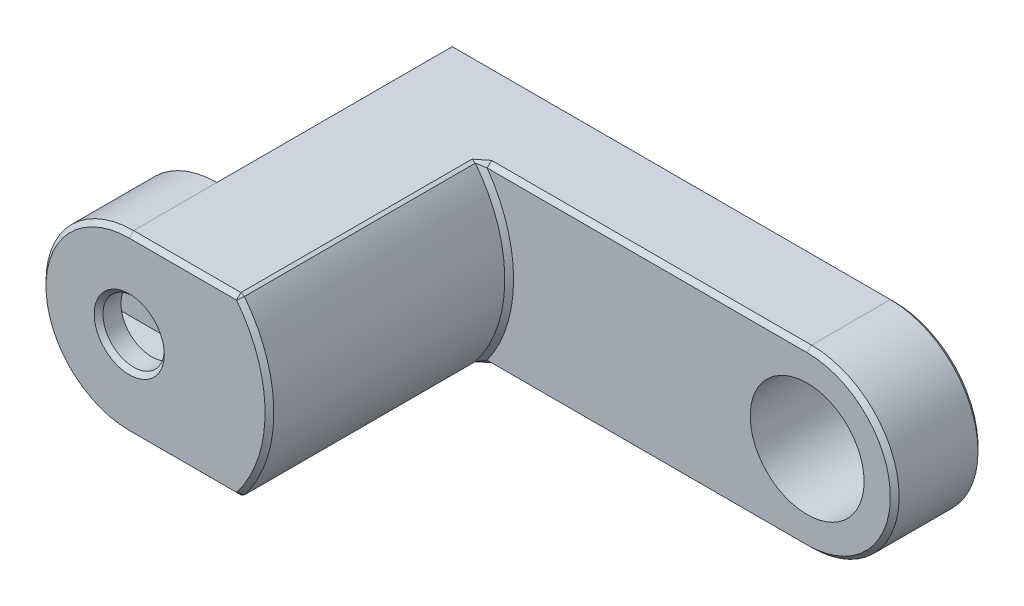
ISO-10303-21;
HEADER;
FILE_DESCRIPTION(('STEP AP214'),'2;1');
FILE_NAME('part.step','',(''),(''),'','','');
FILE_SCHEMA(('AUTOMOTIVE_DESIGN { 1 0 10303 214 1 1 1 1 }'));
ENDSEC;
DATA;
#1=APPLICATION_CONTEXT('core data for automotive mechanical design processes');
#2=APPLICATION_PROTOCOL_DEFINITION('international standard','automotive_design',2000,#1);
#3=PRODUCT_CONTEXT('',#1,'mechanical');
#4=PRODUCT('Part','Part','',(#3));
#5=PRODUCT_RELATED_PRODUCT_CATEGORY('part','',(#4));
#6=PRODUCT_DEFINITION_FORMATION('','',#4);
#7=PRODUCT_DEFINITION_CONTEXT('part definition',#1,'design');
#8=PRODUCT_DEFINITION('design','',#6,#7);
#9=PRODUCT_DEFINITION_SHAPE('','',#8);
#10=(LENGTH_UNIT() NAMED_UNIT(*) SI_UNIT(.MILLI.,.METRE.));
#11=(NAMED_UNIT(*) PLANE_ANGLE_UNIT() SI_UNIT($,.RADIAN.));
#12=(NAMED_UNIT(*) SI_UNIT($,.STERADIAN.) SOLID_ANGLE_UNIT());
#13=UNCERTAINTY_MEASURE_WITH_UNIT(LENGTH_MEASURE(1.E-05),#10,'distance_accuracy_value','');
#14=(GEOMETRIC_REPRESENTATION_CONTEXT(3) GLOBAL_UNCERTAINTY_ASSIGNED_CONTEXT((#13)) GLOBAL_UNIT_ASSIGNED_CONTEXT((#10,
#11,#12)) REPRESENTATION_CONTEXT('',''));
#15=CARTESIAN_POINT('',(0.,0.,0.));
#16=DIRECTION('',(0.,0.,1.));
#17=DIRECTION('',(1.,0.,0.));
#18=AXIS2_PLACEMENT_3D('',#15,#16,#17);
#19=CARTESIAN_POINT('',(13.,0.,18.68));
#20=DIRECTION('',(0.,0.,-1.));
#21=DIRECTION('',(-1.,0.,0.));
#22=AXIS2_PLACEMENT_3D('',#19,#20,#21);
#23=CYLINDRICAL_SURFACE('',#22,5.);
#24=DIRECTION('',(0.,0.,-1.));
#25=VECTOR('',#24,1.);
#26=CARTESIAN_POINT('',(13.,-5.,5.));
#27=LINE('',#26,#25);
#28=CARTESIAN_POINT('',(13.,-5.,18.43));
#29=VERTEX_POINT('',#28);
#30=CARTESIAN_POINT('',(13.,-5.,13.68));
#31=VERTEX_POINT('',#30);
#32=EDGE_CURVE('E252',#29,#31,#27,.T.);
#33=ORIENTED_EDGE('',*,*,#32,.F.);
#34=CARTESIAN_POINT('',(13.,0.,18.43));
#35=DIRECTION('',(0.,0.,1.));
#36=DIRECTION('',(1.,0.,0.));
#37=AXIS2_PLACEMENT_3D('',#34,#35,#36);
#38=CIRCLE('',#37,5.);
#39=CARTESIAN_POINT('',(13.,5.,18.43));
#40=VERTEX_POINT('',#39);
#41=EDGE_CURVE('E352',#29,#40,#38,.F.);
#42=ORIENTED_EDGE('',*,*,#41,.T.);
#43=DIRECTION('',(0.,0.,-1.));
#44=VECTOR('',#43,1.);
#45=CARTESIAN_POINT('',(13.,5.,5.));
#46=LINE('',#45,#44);
#47=CARTESIAN_POINT('',(13.,5.,13.68));
#48=VERTEX_POINT('',#47);
#49=EDGE_CURVE('E239',#40,#48,#46,.T.);
#50=ORIENTED_EDGE('',*,*,#49,.T.);
#51=CARTESIAN_POINT('',(13.,0.,13.68));
#52=DIRECTION('',(0.,0.,-1.));
#53=DIRECTION('',(-1.,0.,0.));
#54=AXIS2_PLACEMENT_3D('',#51,#52,#53);
#55=CIRCLE('',#54,5.);
#56=EDGE_CURVE('E233',#31,#48,#55,.T.);
#57=ORIENTED_EDGE('',*,*,#56,.F.);
#58=EDGE_LOOP('',(#33,#42,#50,#57));
#59=FACE_BOUND('',#58,.T.);
#60=CARTESIAN_POINT('',(13.,0.,14.955));
#61=DIRECTION('',(0.,0.,1.));
#62=DIRECTION('',(1.,0.,0.));
#63=AXIS2_PLACEMENT_3D('',#60,#61,#62);
#64=CIRCLE('',#63,5.);
#65=CARTESIAN_POINT('',(8.85753696455841,2.8,14.955));
#66=VERTEX_POINT('',#65);
#67=CARTESIAN_POINT('',(8.85753696455841,-2.8,14.955));
#68=VERTEX_POINT('',#67);
#69=EDGE_CURVE('E187',#66,#68,#64,.T.);
#70=ORIENTED_EDGE('',*,*,#69,.F.);
#71=DIRECTION('',(0.,0.,-1.));
#72=VECTOR('',#71,1.);
#73=CARTESIAN_POINT('',(8.85753696455841,2.8,18.68));
#74=LINE('',#73,#72);
#75=CARTESIAN_POINT('',(8.85753696455841,2.8,17.405));
#76=VERTEX_POINT('',#75);
#77=EDGE_CURVE('E11',#66,#76,#74,.F.);
#78=ORIENTED_EDGE('',*,*,#77,.T.);
#79=CARTESIAN_POINT('',(13.,0.,17.405));
#80=DIRECTION('',(0.,0.,1.));
#81=DIRECTION('',(1.,0.,0.));
#82=AXIS2_PLACEMENT_3D('',#79,#80,#81);
#83=CIRCLE('',#82,5.);
#84=CARTESIAN_POINT('',(8.85753696455841,-2.8,17.405));
#85=VERTEX_POINT('',#84);
#86=EDGE_CURVE('E222',#76,#85,#83,.T.);
#87=ORIENTED_EDGE('',*,*,#86,.T.);
#88=DIRECTION('',(0.,0.,-1.));
#89=VECTOR('',#88,1.);
#90=CARTESIAN_POINT('',(8.85753696455841,-2.8,18.68));
#91=LINE('',#90,#89);
#92=EDGE_CURVE('E50',#85,#68,#91,.T.);
#93=ORIENTED_EDGE('',*,*,#92,.T.);
#94=EDGE_LOOP('',(#70,#78,#87,#93));
#95=FACE_BOUND('',#94,.T.);
#96=ADVANCED_FACE('F40',(#59,#95),#23,.T.);
#97=CARTESIAN_POINT('',(13.,0.,18.68));
#98=DIRECTION('',(0.,0.,-1.));
#99=DIRECTION('',(-1.,0.,0.));
#100=AXIS2_PLACEMENT_3D('',#97,#98,#99);
#101=CYLINDRICAL_SURFACE('',#100,1.75);
#102=CARTESIAN_POINT('',(13.,0.,13.68));
#103=DIRECTION('',(0.,0.,-1.));
#104=DIRECTION('',(-1.,0.,0.));
#105=AXIS2_PLACEMENT_3D('',#102,#103,#104);
#106=CIRCLE('',#105,1.75);
#107=CARTESIAN_POINT('',(11.25,0.,13.68));
#108=VERTEX_POINT('',#107);
#109=EDGE_CURVE('E229',#108,#108,#106,.T.);
#110=ORIENTED_EDGE('',*,*,#109,.T.);
#111=EDGE_LOOP('',(#110));
#112=FACE_BOUND('',#111,.T.);
#113=CARTESIAN_POINT('',(13.,0.,14.955));
#114=DIRECTION('',(0.,0.,1.));
#115=DIRECTION('',(1.,0.,0.));
#116=AXIS2_PLACEMENT_3D('',#113,#114,#115);
#117=CIRCLE('',#116,1.75);
#118=CARTESIAN_POINT('',(14.75,0.,14.955));
#119=VERTEX_POINT('',#118);
#120=EDGE_CURVE('E226',#119,#119,#117,.T.);
#121=ORIENTED_EDGE('',*,*,#120,.T.);
#122=EDGE_LOOP('',(#121));
#123=FACE_BOUND('',#122,.T.);
#124=ADVANCED_FACE('F396',(#112,#123),#101,.F.);
#125=CARTESIAN_POINT('',(13.,0.,5.));
#126=DIRECTION('',(0.,0.,-1.));
#127=DIRECTION('',(-1.,0.,0.));
#128=AXIS2_PLACEMENT_3D('',#125,#126,#127);
#129=CYLINDRICAL_SURFACE('',#128,5.);
#130=CARTESIAN_POINT('',(13.,-5.,0.249999999999996));
#131=VERTEX_POINT('',#130);
#132=EDGE_CURVE('E251',#31,#131,#27,.T.);
#133=ORIENTED_EDGE('',*,*,#132,.F.);
#134=EDGE_CURVE('E234',#48,#31,#55,.T.);
#135=ORIENTED_EDGE('',*,*,#134,.F.);
#136=CARTESIAN_POINT('',(13.,5.,0.249999999999996));
#137=VERTEX_POINT('',#136);
#138=EDGE_CURVE('E243',#48,#137,#46,.T.);
#139=ORIENTED_EDGE('',*,*,#138,.T.);
#140=CARTESIAN_POINT('',(13.,0.,0.249999999999996));
#141=DIRECTION('',(0.,0.,1.));
#142=DIRECTION('',(1.,0.,0.));
#143=AXIS2_PLACEMENT_3D('',#140,#141,#142);
#144=CIRCLE('',#143,5.);
#145=EDGE_CURVE('E303',#137,#131,#144,.F.);
#146=ORIENTED_EDGE('',*,*,#145,.T.);
#147=EDGE_LOOP('',(#133,#135,#139,#146));
#148=FACE_BOUND('',#147,.T.);
#149=ADVANCED_FACE('F393',(#148),#129,.F.);
#150=CARTESIAN_POINT('',(38.,-5.,5.));
#151=DIRECTION('',(0.,1.,0.));
#152=DIRECTION('',(-1.,0.,0.));
#153=AXIS2_PLACEMENT_3D('',#150,#151,#152);
#154=PLANE('',#153);
#155=DIRECTION('',(-1.,0.,0.));
#156=VECTOR('',#155,1.);
#157=CARTESIAN_POINT('',(19.2449979983984,-5.,4.74999999999996));
#158=LINE('',#157,#156);
#159=CARTESIAN_POINT('',(38.,-5.,4.74999999999996));
#160=VERTEX_POINT('',#159);
#161=CARTESIAN_POINT('',(19.7453687816161,-5.,4.74999999999996));
#162=VERTEX_POINT('',#161);
#163=EDGE_CURVE('E263',#160,#162,#158,.T.);
#164=ORIENTED_EDGE('',*,*,#163,.T.);
#165=CARTESIAN_POINT('',(19.1237243569579,-5.,5.25000000000004));
#166=CARTESIAN_POINT('',(19.2155568659957,-5.,5.17613743050283));
#167=CARTESIAN_POINT('',(19.3073893750334,-5.,5.10227486100562));
#168=CARTESIAN_POINT('',(19.4569130336619,-5.,4.98201024292367));
#169=CARTESIAN_POINT('',(19.5146041832528,-5.,4.93560819433893));
#170=CARTESIAN_POINT('',(19.6299864824344,-5.,4.84280409716944));
#171=CARTESIAN_POINT('',(19.6876776320253,-5.,4.7964020485847));
#172=CARTESIAN_POINT('',(19.7453687816161,-5.,4.74999999999996));
#173=B_SPLINE_CURVE_WITH_KNOTS('',3,(#165,#166,#167,#168,#169,#170,#171,#172),.UNSPECIFIED.,.F.,
.F.,(4,2,2,4),(0.,0.353553390593329,0.575663205067505,0.797773019541681),.UNSPECIFIED.);
#174=CARTESIAN_POINT('',(19.1237243569579,-5.,5.25000000000004));
#175=VERTEX_POINT('',#174);
#176=EDGE_CURVE('E365',#162,#175,#173,.F.);
#177=ORIENTED_EDGE('',*,*,#176,.T.);
#178=DIRECTION('',(0.,0.,1.));
#179=VECTOR('',#178,1.);
#180=CARTESIAN_POINT('',(19.1237243569579,-5.,5.));
#181=LINE('',#180,#179);
#182=CARTESIAN_POINT('',(19.1237243569579,-5.,18.43));
#183=VERTEX_POINT('',#182);
#184=EDGE_CURVE('E260',#175,#183,#181,.T.);
#185=ORIENTED_EDGE('',*,*,#184,.T.);
#186=DIRECTION('',(-1.,0.,0.));
#187=VECTOR('',#186,1.);
#188=CARTESIAN_POINT('',(13.,-5.,18.43));
#189=LINE('',#188,#187);
#190=EDGE_CURVE('E256',#183,#29,#189,.T.);
#191=ORIENTED_EDGE('',*,*,#190,.T.);
#192=ORIENTED_EDGE('',*,*,#32,.T.);
#193=ORIENTED_EDGE('',*,*,#132,.T.);
#194=DIRECTION('',(1.,0.,0.));
#195=VECTOR('',#194,1.);
#196=CARTESIAN_POINT('',(38.,-5.,0.249999999999996));
#197=LINE('',#196,#195);
#198=CARTESIAN_POINT('',(38.,-5.,0.249999999999996));
#199=VERTEX_POINT('',#198);
#200=EDGE_CURVE('E266',#131,#199,#197,.T.);
#201=ORIENTED_EDGE('',*,*,#200,.T.);
#202=DIRECTION('',(0.,0.,-1.));
#203=VECTOR('',#202,1.);
#204=CARTESIAN_POINT('',(38.,-5.,5.));
#205=LINE('',#204,#203);
#206=EDGE_CURVE('E247',#160,#199,#205,.T.);
#207=ORIENTED_EDGE('',*,*,#206,.F.);
#208=EDGE_LOOP('',(#164,#177,#185,#191,#192,#193,#201,#207));
#209=FACE_BOUND('',#208,.T.);
#210=ADVANCED_FACE('F389',(#209),#154,.F.);
#211=CARTESIAN_POINT('',(38.,0.,5.));
#212=DIRECTION('',(0.,0.,-1.));
#213=DIRECTION('',(-1.,0.,0.));
#214=AXIS2_PLACEMENT_3D('',#211,#212,#213);
#215=CYLINDRICAL_SURFACE('',#214,5.);
#216=ORIENTED_EDGE('',*,*,#206,.T.);
#217=CARTESIAN_POINT('',(38.,0.,0.249999999999996));
#218=DIRECTION('',(0.,0.,1.));
#219=DIRECTION('',(1.,0.,0.));
#220=AXIS2_PLACEMENT_3D('',#217,#218,#219);
#221=CIRCLE('',#220,5.);
#222=CARTESIAN_POINT('',(38.,5.,0.249999999999996));
#223=VERTEX_POINT('',#222);
#224=EDGE_CURVE('E286',#199,#223,#221,.T.);
#225=ORIENTED_EDGE('',*,*,#224,.T.);
#226=DIRECTION('',(0.,0.,-1.));
#227=VECTOR('',#226,1.);
#228=CARTESIAN_POINT('',(38.,5.,5.));
#229=LINE('',#228,#227);
#230=CARTESIAN_POINT('',(38.,5.,4.74999999999996));
#231=VERTEX_POINT('',#230);
#232=EDGE_CURVE('E242',#231,#223,#229,.T.);
#233=ORIENTED_EDGE('',*,*,#232,.F.);
#234=CARTESIAN_POINT('',(38.,0.,4.74999999999996));
#235=DIRECTION('',(0.,0.,1.));
#236=DIRECTION('',(1.,0.,0.));
#237=AXIS2_PLACEMENT_3D('',#234,#235,#236);
#238=CIRCLE('',#237,5.);
#239=EDGE_CURVE('E283',#231,#160,#238,.F.);
#240=ORIENTED_EDGE('',*,*,#239,.T.);
#241=EDGE_LOOP('',(#216,#225,#233,#240));
#242=FACE_BOUND('',#241,.T.);
#243=ADVANCED_FACE('F384',(#242),#215,.T.);
#244=CARTESIAN_POINT('',(13.,5.,5.));
#245=DIRECTION('',(0.,-1.,0.));
#246=DIRECTION('',(1.,0.,0.));
#247=AXIS2_PLACEMENT_3D('',#244,#245,#246);
#248=PLANE('',#247);
#249=DIRECTION('',(0.,0.,-1.));
#250=VECTOR('',#249,1.);
#251=CARTESIAN_POINT('',(19.1237243569579,5.,5.));
#252=LINE('',#251,#250);
#253=CARTESIAN_POINT('',(19.1237243569579,5.,18.43));
#254=VERTEX_POINT('',#253);
#255=CARTESIAN_POINT('',(19.1237243569579,5.,5.25000000000004));
#256=VERTEX_POINT('',#255);
#257=EDGE_CURVE('E292',#254,#256,#252,.T.);
#258=ORIENTED_EDGE('',*,*,#257,.T.);
#259=CARTESIAN_POINT('',(19.7453687816161,5.,4.74999999999996));
#260=CARTESIAN_POINT('',(19.6535362725784,5.,4.82386256949717));
#261=CARTESIAN_POINT('',(19.5617037635407,5.,4.89772513899438));
#262=CARTESIAN_POINT('',(19.4121801049121,5.,5.01798975707633));
#263=CARTESIAN_POINT('',(19.3544889553213,5.,5.06439180566108));
#264=CARTESIAN_POINT('',(19.2391066561396,5.,5.15719590283056));
#265=CARTESIAN_POINT('',(19.1814155065488,5.,5.2035979514153));
#266=CARTESIAN_POINT('',(19.1237243569579,5.,5.25000000000004));
#267=B_SPLINE_CURVE_WITH_KNOTS('',3,(#259,#260,#261,#262,#263,#264,#265,#266),.UNSPECIFIED.,.F.,
.F.,(4,2,2,4),(0.,0.353553390593328,0.575663205067509,0.797773019541684),.UNSPECIFIED.);
#268=CARTESIAN_POINT('',(19.7453687816161,5.,4.74999999999996));
#269=VERTEX_POINT('',#268);
#270=EDGE_CURVE('E356',#256,#269,#267,.F.);
#271=ORIENTED_EDGE('',*,*,#270,.T.);
#272=DIRECTION('',(1.,0.,0.));
#273=VECTOR('',#272,1.);
#274=CARTESIAN_POINT('',(38.,5.,4.74999999999996));
#275=LINE('',#274,#273);
#276=EDGE_CURVE('E296',#269,#231,#275,.T.);
#277=ORIENTED_EDGE('',*,*,#276,.T.);
#278=ORIENTED_EDGE('',*,*,#232,.T.);
#279=DIRECTION('',(-1.,0.,0.));
#280=VECTOR('',#279,1.);
#281=CARTESIAN_POINT('',(13.,5.,0.249999999999996));
#282=LINE('',#281,#280);
#283=EDGE_CURVE('E299',#223,#137,#282,.T.);
#284=ORIENTED_EDGE('',*,*,#283,.T.);
#285=ORIENTED_EDGE('',*,*,#138,.F.);
#286=ORIENTED_EDGE('',*,*,#49,.F.);
#287=DIRECTION('',(1.,0.,0.));
#288=VECTOR('',#287,1.);
#289=CARTESIAN_POINT('',(19.2449979983984,5.,18.43));
#290=LINE('',#289,#288);
#291=EDGE_CURVE('E289',#40,#254,#290,.T.);
#292=ORIENTED_EDGE('',*,*,#291,.T.);
#293=EDGE_LOOP('',(#258,#271,#277,#278,#284,#285,#286,#292));
#294=FACE_BOUND('',#293,.T.);
#295=ADVANCED_FACE('F378',(#294),#248,.F.);
#296=CARTESIAN_POINT('',(13.,0.,5.));
#297=DIRECTION('',(0.,0.,1.));
#298=DIRECTION('',(1.,0.,0.));
#299=AXIS2_PLACEMENT_3D('',#296,#297,#298);
#300=PLANE('',#299);
#301=CARTESIAN_POINT('',(38.,0.,5.));
#302=DIRECTION('',(0.,0.,1.));
#303=DIRECTION('',(1.,0.,0.));
#304=AXIS2_PLACEMENT_3D('',#301,#302,#303);
#305=CIRCLE('',#304,3.25);
#306=CARTESIAN_POINT('',(41.25,0.,5.));
#307=VERTEX_POINT('',#306);
#308=EDGE_CURVE('E213',#307,#307,#305,.F.);
#309=ORIENTED_EDGE('',*,*,#308,.T.);
#310=EDGE_LOOP('',(#309));
#311=FACE_BOUND('',#310,.T.);
#312=CARTESIAN_POINT('',(38.,0.,5.));
#313=DIRECTION('',(0.,0.,1.));
#314=DIRECTION('',(1.,0.,0.));
#315=AXIS2_PLACEMENT_3D('',#312,#313,#314);
#316=CIRCLE('',#315,4.74999999999996);
#317=CARTESIAN_POINT('',(38.,-4.74999999999996,5.));
#318=VERTEX_POINT('',#317);
#319=CARTESIAN_POINT('',(38.,4.74999999999996,5.));
#320=VERTEX_POINT('',#319);
#321=EDGE_CURVE('E326',#318,#320,#316,.T.);
#322=ORIENTED_EDGE('',*,*,#321,.T.);
#323=DIRECTION('',(-1.,0.,0.));
#324=VECTOR('',#323,1.);
#325=CARTESIAN_POINT('',(19.2449979983984,4.74999999999996,5.));
#326=LINE('',#325,#324);
#327=CARTESIAN_POINT('',(19.7453687816161,4.74999999999996,5.));
#328=VERTEX_POINT('',#327);
#329=EDGE_CURVE('E329',#320,#328,#326,.T.);
#330=ORIENTED_EDGE('',*,*,#329,.T.);
#331=CARTESIAN_POINT('',(13.,0.,5.));
#332=DIRECTION('',(0.,0.,1.));
#333=DIRECTION('',(1.,0.,0.));
#334=AXIS2_PLACEMENT_3D('',#331,#332,#333);
#335=CIRCLE('',#334,8.25000000000004);
#336=CARTESIAN_POINT('',(19.7453687816161,-4.74999999999996,5.));
#337=VERTEX_POINT('',#336);
#338=EDGE_CURVE('E320',#328,#337,#335,.F.);
#339=ORIENTED_EDGE('',*,*,#338,.T.);
#340=DIRECTION('',(1.,0.,0.));
#341=VECTOR('',#340,1.);
#342=CARTESIAN_POINT('',(38.,-4.74999999999996,5.));
#343=LINE('',#342,#341);
#344=EDGE_CURVE('E323',#337,#318,#343,.T.);
#345=ORIENTED_EDGE('',*,*,#344,.T.);
#346=EDGE_LOOP('',(#322,#330,#339,#345));
#347=FACE_BOUND('',#346,.T.);
#348=ADVANCED_FACE('F383',(#311,#347),#300,.T.);
#349=CARTESIAN_POINT('',(13.,0.,0.));
#350=DIRECTION('',(0.,0.,1.));
#351=DIRECTION('',(1.,0.,0.));
#352=AXIS2_PLACEMENT_3D('',#349,#350,#351);
#353=PLANE('',#352);
#354=CARTESIAN_POINT('',(38.,0.,0.));
#355=DIRECTION('',(0.,0.,1.));
#356=DIRECTION('',(1.,0.,0.));
#357=AXIS2_PLACEMENT_3D('',#354,#355,#356);
#358=CIRCLE('',#357,3.25);
#359=CARTESIAN_POINT('',(41.25,0.,0.));
#360=VERTEX_POINT('',#359);
#361=EDGE_CURVE('E982',#360,#360,#358,.T.);
#362=ORIENTED_EDGE('',*,*,#361,.T.);
#363=EDGE_LOOP('',(#362));
#364=FACE_BOUND('',#363,.T.);
#365=CARTESIAN_POINT('',(38.,0.,0.));
#366=DIRECTION('',(0.,0.,1.));
#367=DIRECTION('',(1.,0.,0.));
#368=AXIS2_PLACEMENT_3D('',#365,#366,#367);
#369=CIRCLE('',#368,4.75);
#370=CARTESIAN_POINT('',(38.,4.75,0.));
#371=VERTEX_POINT('',#370);
#372=CARTESIAN_POINT('',(38.,-4.75,0.));
#373=VERTEX_POINT('',#372);
#374=EDGE_CURVE('E276',#371,#373,#369,.F.);
#375=ORIENTED_EDGE('',*,*,#374,.T.);
#376=DIRECTION('',(-1.,0.,0.));
#377=VECTOR('',#376,1.);
#378=CARTESIAN_POINT('',(13.,-4.75,0.));
#379=LINE('',#378,#377);
#380=CARTESIAN_POINT('',(15.2360679774998,-4.75,0.));
#381=VERTEX_POINT('',#380);
#382=EDGE_CURVE('E279',#373,#381,#379,.T.);
#383=ORIENTED_EDGE('',*,*,#382,.T.);
#384=CARTESIAN_POINT('',(13.,0.,0.));
#385=DIRECTION('',(0.,0.,1.));
#386=DIRECTION('',(1.,0.,0.));
#387=AXIS2_PLACEMENT_3D('',#384,#385,#386);
#388=CIRCLE('',#387,5.25);
#389=CARTESIAN_POINT('',(15.2360679774998,4.75,0.));
#390=VERTEX_POINT('',#389);
#391=EDGE_CURVE('E270',#381,#390,#388,.T.);
#392=ORIENTED_EDGE('',*,*,#391,.T.);
#393=DIRECTION('',(1.,0.,0.));
#394=VECTOR('',#393,1.);
#395=CARTESIAN_POINT('',(13.,4.75,0.));
#396=LINE('',#395,#394);
#397=EDGE_CURVE('E273',#390,#371,#396,.T.);
#398=ORIENTED_EDGE('',*,*,#397,.T.);
#399=EDGE_LOOP('',(#375,#383,#392,#398));
#400=FACE_BOUND('',#399,.T.);
#401=ADVANCED_FACE('F386',(#364,#400),#353,.F.);
#402=CARTESIAN_POINT('',(13.,0.,15.68));
#403=DIRECTION('',(0.,0.,-1.));
#404=DIRECTION('',(-1.,0.,0.));
#405=AXIS2_PLACEMENT_3D('',#402,#403,#404);
#406=CYLINDRICAL_SURFACE('',#405,8.);
#407=DIRECTION('',(0.,0.,-1.));
#408=VECTOR('',#407,1.);
#409=CARTESIAN_POINT('',(19.3212638523437,-4.90322580645159,15.68));
#410=LINE('',#409,#408);
#411=CARTESIAN_POINT('',(19.3212638523437,-4.90322580645159,18.43));
#412=VERTEX_POINT('',#411);
#413=CARTESIAN_POINT('',(19.3212638523437,-4.9032258064516,5.25000000000004));
#414=VERTEX_POINT('',#413);
#415=EDGE_CURVE('E310',#412,#414,#410,.T.);
#416=ORIENTED_EDGE('',*,*,#415,.T.);
#417=CARTESIAN_POINT('',(13.,0.,5.25000000000004));
#418=DIRECTION('',(0.,0.,1.));
#419=DIRECTION('',(1.,0.,0.));
#420=AXIS2_PLACEMENT_3D('',#417,#418,#419);
#421=CIRCLE('',#420,8.);
#422=CARTESIAN_POINT('',(19.3212638523437,4.9032258064516,5.25000000000004));
#423=VERTEX_POINT('',#422);
#424=EDGE_CURVE('E317',#414,#423,#421,.T.);
#425=ORIENTED_EDGE('',*,*,#424,.T.);
#426=DIRECTION('',(0.,0.,-1.));
#427=VECTOR('',#426,1.);
#428=CARTESIAN_POINT('',(19.3212638523437,4.9032258064516,15.68));
#429=LINE('',#428,#427);
#430=CARTESIAN_POINT('',(19.3212638523437,4.9032258064516,18.43));
#431=VERTEX_POINT('',#430);
#432=EDGE_CURVE('E313',#423,#431,#429,.F.);
#433=ORIENTED_EDGE('',*,*,#432,.T.);
#434=CARTESIAN_POINT('',(13.,0.,18.43));
#435=DIRECTION('',(0.,0.,1.));
#436=DIRECTION('',(1.,0.,0.));
#437=AXIS2_PLACEMENT_3D('',#434,#435,#436);
#438=CIRCLE('',#437,8.);
#439=EDGE_CURVE('E307',#431,#412,#438,.F.);
#440=ORIENTED_EDGE('',*,*,#439,.T.);
#441=EDGE_LOOP('',(#416,#425,#433,#440));
#442=FACE_BOUND('',#441,.T.);
#443=ADVANCED_FACE('F414',(#442),#406,.T.);
#444=CARTESIAN_POINT('',(13.,0.,18.68));
#445=DIRECTION('',(0.,0.,1.));
#446=DIRECTION('',(1.,0.,0.));
#447=AXIS2_PLACEMENT_3D('',#444,#445,#446);
#448=PLANE('',#447);
#449=CARTESIAN_POINT('',(13.,0.,18.68));
#450=DIRECTION('',(0.,0.,1.));
#451=DIRECTION('',(1.,0.,0.));
#452=AXIS2_PLACEMENT_3D('',#449,#450,#451);
#453=CIRCLE('',#452,2.00000000000001);
#454=CARTESIAN_POINT('',(15.,0.,18.68));
#455=VERTEX_POINT('',#454);
#456=EDGE_CURVE('E348',#455,#455,#453,.F.);
#457=ORIENTED_EDGE('',*,*,#456,.T.);
#458=EDGE_LOOP('',(#457));
#459=FACE_BOUND('',#458,.T.);
#460=CARTESIAN_POINT('',(13.,0.,18.68));
#461=DIRECTION('',(0.,0.,1.));
#462=DIRECTION('',(1.,0.,0.));
#463=AXIS2_PLACEMENT_3D('',#460,#461,#462);
#464=CIRCLE('',#463,4.75000000000001);
#465=CARTESIAN_POINT('',(13.,4.75000000000001,18.68));
#466=VERTEX_POINT('',#465);
#467=CARTESIAN_POINT('',(13.,-4.75000000000001,18.68));
#468=VERTEX_POINT('',#467);
#469=EDGE_CURVE('E65',#466,#468,#464,.T.);
#470=ORIENTED_EDGE('',*,*,#469,.T.);
#471=DIRECTION('',(1.,0.,0.));
#472=VECTOR('',#471,1.);
#473=CARTESIAN_POINT('',(19.2449979983984,-4.75000000000001,18.68));
#474=LINE('',#473,#472);
#475=CARTESIAN_POINT('',(19.123724356958,-4.75000000000001,18.68));
#476=VERTEX_POINT('',#475);
#477=EDGE_CURVE('E345',#468,#476,#474,.T.);
#478=ORIENTED_EDGE('',*,*,#477,.T.);
#479=CARTESIAN_POINT('',(13.,0.,18.68));
#480=DIRECTION('',(0.,0.,1.));
#481=DIRECTION('',(1.,0.,0.));
#482=AXIS2_PLACEMENT_3D('',#479,#480,#481);
#483=CIRCLE('',#482,7.75000000000001);
#484=CARTESIAN_POINT('',(19.123724356958,4.75000000000001,18.68));
#485=VERTEX_POINT('',#484);
#486=EDGE_CURVE('E337',#476,#485,#483,.T.);
#487=ORIENTED_EDGE('',*,*,#486,.T.);
#488=DIRECTION('',(-1.,0.,0.));
#489=VECTOR('',#488,1.);
#490=CARTESIAN_POINT('',(13.,4.75000000000001,18.68));
#491=LINE('',#490,#489);
#492=EDGE_CURVE('E340',#485,#466,#491,.T.);
#493=ORIENTED_EDGE('',*,*,#492,.T.);
#494=EDGE_LOOP('',(#470,#478,#487,#493));
#495=FACE_BOUND('',#494,.T.);
#496=ADVANCED_FACE('F413',(#459,#495),#448,.T.);
#497=CARTESIAN_POINT('',(13.,0.,17.405));
#498=DIRECTION('',(0.,0.,1.));
#499=DIRECTION('',(1.,0.,0.));
#500=AXIS2_PLACEMENT_3D('',#497,#498,#499);
#501=CIRCLE('',#500,1.75);
#502=CARTESIAN_POINT('',(14.75,0.,17.405));
#503=VERTEX_POINT('',#502);
#504=EDGE_CURVE('E220',#503,#503,#501,.T.);
#505=ORIENTED_EDGE('',*,*,#504,.F.);
#506=EDGE_LOOP('',(#505));
#507=FACE_BOUND('',#506,.T.);
#508=CARTESIAN_POINT('',(13.,0.,18.43));
#509=DIRECTION('',(0.,0.,1.));
#510=DIRECTION('',(1.,0.,0.));
#511=AXIS2_PLACEMENT_3D('',#508,#509,#510);
#512=CIRCLE('',#511,1.75);
#513=CARTESIAN_POINT('',(14.75,0.,18.43));
#514=VERTEX_POINT('',#513);
#515=EDGE_CURVE('E333',#514,#514,#512,.T.);
#516=ORIENTED_EDGE('',*,*,#515,.T.);
#517=EDGE_LOOP('',(#516));
#518=FACE_BOUND('',#517,.T.);
#519=ADVANCED_FACE('F403',(#507,#518),#101,.F.);
#520=CARTESIAN_POINT('',(13.,5.,0.249999999999996));
#521=DIRECTION('',(0.,-0.707106781186541,0.707106781186554));
#522=DIRECTION('',(-1.,0.,0.));
#523=AXIS2_PLACEMENT_3D('',#520,#521,#522);
#524=PLANE('',#523);
#525=DIRECTION('',(0.,0.707106781186554,0.707106781186541));
#526=VECTOR('',#525,1.);
#527=CARTESIAN_POINT('',(38.,4.75,0.));
#528=LINE('',#527,#526);
#529=EDGE_CURVE('E595',#371,#223,#528,.T.);
#530=ORIENTED_EDGE('',*,*,#529,.F.);
#531=ORIENTED_EDGE('',*,*,#397,.F.);
#532=CARTESIAN_POINT('',(13.,5.,0.249999999999996));
#533=CARTESIAN_POINT('',(13.0950100328751,5.00000193498748,0.250001934987482));
#534=CARTESIAN_POINT('',(13.1900092237627,4.99864567975109,0.248645679751087));
#535=CARTESIAN_POINT('',(13.3798500456755,4.99323583058947,0.243235830589469));
#536=CARTESIAN_POINT('',(13.4746916831179,4.98918234936678,0.239182349366773));
#537=CARTESIAN_POINT('',(13.7576392364466,4.97306989403023,0.223069894030223));
#538=CARTESIAN_POINT('',(13.9453238481979,4.95705827382409,0.207058273824087));
#539=CARTESIAN_POINT('',(14.3182662936352,4.91484571840696,0.164845718406955));
#540=CARTESIAN_POINT('',(14.5035250746721,4.8886488913773,0.138648891377295));
#541=CARTESIAN_POINT('',(14.8719140028892,4.8265114620302,0.0765114620301979));
#542=CARTESIAN_POINT('',(15.0550250489479,4.79051407948644,0.0405140794864393));
#543=CARTESIAN_POINT('',(15.2360679774998,4.75,0.));
#544=B_SPLINE_CURVE_WITH_KNOTS('',3,(#532,#533,#534,#535,#536,#537,#538,#539,#540,#541,#542,
#543),.UNSPECIFIED.,.F.,.F.,(4,2,2,2,2,4),(0.,0.284989443039261,0.569966978654364,
1.13646391848597,1.70273259964377,2.27235450267005),.UNSPECIFIED.);
#545=EDGE_CURVE('E585',#137,#390,#544,.T.);
#546=ORIENTED_EDGE('',*,*,#545,.F.);
#547=ORIENTED_EDGE('',*,*,#283,.F.);
#548=EDGE_LOOP('',(#530,#531,#546,#547));
#549=FACE_BOUND('',#548,.T.);
#550=ADVANCED_FACE('F602',(#549),#524,.F.);
#551=CARTESIAN_POINT('',(13.,0.,0.249999999999996));
#552=DIRECTION('',(0.,0.,-1.));
#553=DIRECTION('',(-1.,0.,0.));
#554=AXIS2_PLACEMENT_3D('',#551,#552,#553);
#555=CONICAL_SURFACE('',#554,5.,0.785398163397459);
#556=ORIENTED_EDGE('',*,*,#545,.T.);
#557=ORIENTED_EDGE('',*,*,#391,.F.);
#558=CARTESIAN_POINT('',(15.2360679774998,-4.75,0.));
#559=CARTESIAN_POINT('',(15.0550250489479,-4.79051407948644,0.0405140794864394));
#560=CARTESIAN_POINT('',(14.8719140028892,-4.8265114620302,0.0765114620301979));
#561=CARTESIAN_POINT('',(14.5035250746721,-4.8886488913773,0.138648891377295));
#562=CARTESIAN_POINT('',(14.3182662936352,-4.91484571840696,0.164845718406955));
#563=CARTESIAN_POINT('',(13.9453238481979,-4.95705827382409,0.207058273824087));
#564=CARTESIAN_POINT('',(13.7576392364466,-4.97306989403022,0.223069894030223));
#565=CARTESIAN_POINT('',(13.4746916831179,-4.98918234936678,0.239182349366773));
#566=CARTESIAN_POINT('',(13.3798500456755,-4.99323583058947,0.243235830589469));
#567=CARTESIAN_POINT('',(13.1900092237627,-4.99864567975109,0.248645679751088));
#568=CARTESIAN_POINT('',(13.0950100328751,-5.00000193498748,0.250001934987482));
#569=CARTESIAN_POINT('',(13.,-5.,0.249999999999996));
#570=B_SPLINE_CURVE_WITH_KNOTS('',3,(#558,#559,#560,#561,#562,#563,#564,#565,#566,#567,#568,
#569),.UNSPECIFIED.,.F.,.F.,(4,2,2,2,2,4),(0.,0.569621903026277,1.13589058418408,
1.70238752401568,1.98736505963079,2.27235450267005),.UNSPECIFIED.);
#571=EDGE_CURVE('E675',#131,#381,#570,.F.);
#572=ORIENTED_EDGE('',*,*,#571,.F.);
#573=ORIENTED_EDGE('',*,*,#145,.F.);
#574=EDGE_LOOP('',(#556,#557,#572,#573));
#575=FACE_BOUND('',#574,.T.);
#576=ADVANCED_FACE('F598',(#575),#555,.F.);
#577=CARTESIAN_POINT('',(38.,0.,0.249999999999996));
#578=DIRECTION('',(0.,0.,1.));
#579=DIRECTION('',(1.,0.,0.));
#580=AXIS2_PLACEMENT_3D('',#577,#578,#579);
#581=CONICAL_SURFACE('',#580,5.,0.785398163397457);
#582=ORIENTED_EDGE('',*,*,#529,.T.);
#583=ORIENTED_EDGE('',*,*,#224,.F.);
#584=DIRECTION('',(0.,-0.707106781186554,0.707106781186541));
#585=VECTOR('',#584,1.);
#586=CARTESIAN_POINT('',(38.,-4.75,0.));
#587=LINE('',#586,#585);
#588=EDGE_CURVE('E495',#373,#199,#587,.T.);
#589=ORIENTED_EDGE('',*,*,#588,.F.);
#590=ORIENTED_EDGE('',*,*,#374,.F.);
#591=EDGE_LOOP('',(#582,#583,#589,#590));
#592=FACE_BOUND('',#591,.T.);
#593=ADVANCED_FACE('F611',(#592),#581,.T.);
#594=CARTESIAN_POINT('',(38.,-5.,0.249999999999996));
#595=DIRECTION('',(0.,0.707106781186541,0.707106781186554));
#596=DIRECTION('',(1.,0.,0.));
#597=AXIS2_PLACEMENT_3D('',#594,#595,#596);
#598=PLANE('',#597);
#599=ORIENTED_EDGE('',*,*,#571,.T.);
#600=ORIENTED_EDGE('',*,*,#382,.F.);
#601=ORIENTED_EDGE('',*,*,#588,.T.);
#602=ORIENTED_EDGE('',*,*,#200,.F.);
#603=EDGE_LOOP('',(#599,#600,#601,#602));
#604=FACE_BOUND('',#603,.T.);
#605=ADVANCED_FACE('F662',(#604),#598,.F.);
#606=CARTESIAN_POINT('',(13.,-4.75000000000001,18.68));
#607=DIRECTION('',(0.,-0.707106781186547,0.707106781186547));
#608=DIRECTION('',(-1.,0.,0.));
#609=AXIS2_PLACEMENT_3D('',#606,#607,#608);
#610=PLANE('',#609);
#611=DIRECTION('',(0.,0.707106781186547,0.707106781186547));
#612=VECTOR('',#611,1.);
#613=CARTESIAN_POINT('',(13.,-5.,18.43));
#614=LINE('',#613,#612);
#615=EDGE_CURVE('E478',#29,#468,#614,.T.);
#616=ORIENTED_EDGE('',*,*,#615,.F.);
#617=ORIENTED_EDGE('',*,*,#190,.F.);
#618=DIRECTION('',(0.,-0.707106781186548,-0.707106781186548));
#619=VECTOR('',#618,1.);
#620=CARTESIAN_POINT('',(19.1237243569579,-5.,18.43));
#621=LINE('',#620,#619);
#622=EDGE_CURVE('E487',#476,#183,#621,.T.);
#623=ORIENTED_EDGE('',*,*,#622,.F.);
#624=ORIENTED_EDGE('',*,*,#477,.F.);
#625=EDGE_LOOP('',(#616,#617,#623,#624));
#626=FACE_BOUND('',#625,.T.);
#627=ADVANCED_FACE('F518',(#626),#610,.T.);
#628=CARTESIAN_POINT('',(13.,-4.74999999999996,5.));
#629=DIRECTION('',(0.,-0.707106781186545,0.70710678118655));
#630=DIRECTION('',(-1.,0.,0.));
#631=AXIS2_PLACEMENT_3D('',#628,#629,#630);
#632=PLANE('',#631);
#633=DIRECTION('',(0.,0.70710678118655,0.707106781186545));
#634=VECTOR('',#633,1.);
#635=CARTESIAN_POINT('',(19.7453687816161,-5.,4.74999999999996));
#636=LINE('',#635,#634);
#637=EDGE_CURVE('E467',#162,#337,#636,.T.);
#638=ORIENTED_EDGE('',*,*,#637,.F.);
#639=ORIENTED_EDGE('',*,*,#163,.F.);
#640=DIRECTION('',(0.,-0.70710678118655,-0.707106781186545));
#641=VECTOR('',#640,1.);
#642=CARTESIAN_POINT('',(38.,-4.74999999999996,5.));
#643=LINE('',#642,#641);
#644=EDGE_CURVE('E469',#318,#160,#643,.T.);
#645=ORIENTED_EDGE('',*,*,#644,.F.);
#646=ORIENTED_EDGE('',*,*,#344,.F.);
#647=EDGE_LOOP('',(#638,#639,#645,#646));
#648=FACE_BOUND('',#647,.T.);
#649=ADVANCED_FACE('F465',(#648),#632,.T.);
#650=CARTESIAN_POINT('',(19.3212638523437,-4.90322580645159,15.68));
#651=DIRECTION('',(-0.439941345064067,0.898026510133871,0.));
#652=DIRECTION('',(0.,0.,-1.));
#653=AXIS2_PLACEMENT_3D('',#650,#651,#652);
#654=PLANE('',#653);
#655=DIRECTION('',(-0.898026510133871,-0.439941345064067,0.));
#656=VECTOR('',#655,1.);
#657=CARTESIAN_POINT('',(19.1237243569579,-5.,18.43));
#658=LINE('',#657,#656);
#659=EDGE_CURVE('E491',#183,#412,#658,.F.);
#660=ORIENTED_EDGE('',*,*,#659,.F.);
#661=ORIENTED_EDGE('',*,*,#184,.F.);
#662=DIRECTION('',(-0.898026510133868,-0.439941345064073,0.));
#663=VECTOR('',#662,1.);
#664=CARTESIAN_POINT('',(19.3212638523437,-4.9032258064516,5.25000000000004));
#665=LINE('',#664,#663);
#666=EDGE_CURVE('E474',#414,#175,#665,.T.);
#667=ORIENTED_EDGE('',*,*,#666,.F.);
#668=ORIENTED_EDGE('',*,*,#415,.F.);
#669=EDGE_LOOP('',(#660,#661,#667,#668));
#670=FACE_BOUND('',#669,.T.);
#671=ADVANCED_FACE('F509',(#670),#654,.F.);
#672=CARTESIAN_POINT('',(19.1237243569579,-5.,18.43));
#673=DIRECTION('',(0.327326835354009,-0.668153104781072,0.66815310478104));
#674=DIRECTION('',(0.,-0.707106781186531,-0.707106781186564));
#675=AXIS2_PLACEMENT_3D('',#672,#673,#674);
#676=PLANE('',#675);
#677=ORIENTED_EDGE('',*,*,#622,.T.);
#678=ORIENTED_EDGE('',*,*,#659,.T.);
#679=DIRECTION('',(-0.558726066957752,0.433388027178784,0.70710678118655));
#680=VECTOR('',#679,1.);
#681=CARTESIAN_POINT('',(13.0000000000001,-2.02256122933635E-13,26.4300000000003));
#682=LINE('',#681,#680);
#683=EDGE_CURVE('E480',#476,#412,#682,.F.);
#684=ORIENTED_EDGE('',*,*,#683,.F.);
#685=EDGE_LOOP('',(#677,#678,#684));
#686=FACE_BOUND('',#685,.T.);
#687=ADVANCED_FACE('F515',(#686),#676,.T.);
#688=CARTESIAN_POINT('',(13.,0.,18.68));
#689=DIRECTION('',(0.,0.,-1.));
#690=DIRECTION('',(-1.,0.,0.));
#691=AXIS2_PLACEMENT_3D('',#688,#689,#690);
#692=CONICAL_SURFACE('',#691,4.75000000000001,0.785398163397448);
#693=ORIENTED_EDGE('',*,*,#615,.T.);
#694=ORIENTED_EDGE('',*,*,#469,.F.);
#695=DIRECTION('',(0.,-0.707106781186547,0.707106781186547));
#696=VECTOR('',#695,1.);
#697=CARTESIAN_POINT('',(13.,5.,18.43));
#698=LINE('',#697,#696);
#699=EDGE_CURVE('E441',#40,#466,#698,.T.);
#700=ORIENTED_EDGE('',*,*,#699,.F.);
#701=ORIENTED_EDGE('',*,*,#41,.F.);
#702=EDGE_LOOP('',(#693,#694,#700,#701));
#703=FACE_BOUND('',#702,.T.);
#704=ADVANCED_FACE('F629',(#703),#692,.T.);
#705=CARTESIAN_POINT('',(38.,0.,5.));
#706=DIRECTION('',(0.,0.,-1.));
#707=DIRECTION('',(-1.,0.,0.));
#708=AXIS2_PLACEMENT_3D('',#705,#706,#707);
#709=CONICAL_SURFACE('',#708,4.74999999999996,0.785398163397452);
#710=ORIENTED_EDGE('',*,*,#644,.T.);
#711=ORIENTED_EDGE('',*,*,#239,.F.);
#712=DIRECTION('',(0.,0.70710678118655,-0.707106781186545));
#713=VECTOR('',#712,1.);
#714=CARTESIAN_POINT('',(38.,4.74999999999996,5.));
#715=LINE('',#714,#713);
#716=EDGE_CURVE('E436',#320,#231,#715,.T.);
#717=ORIENTED_EDGE('',*,*,#716,.F.);
#718=ORIENTED_EDGE('',*,*,#321,.F.);
#719=EDGE_LOOP('',(#710,#711,#717,#718));
#720=FACE_BOUND('',#719,.T.);
#721=ADVANCED_FACE('F437',(#720),#709,.T.);
#722=CARTESIAN_POINT('',(19.3268680702067,-4.90048031161723,5.25000000000004));
#723=CARTESIAN_POINT('',(19.7453687816161,-4.74290747167784,5.00709252832212));
#724=CARTESIAN_POINT('',(19.3212638523437,-4.9032258064516,5.25000000000004));
#725=CARTESIAN_POINT('',(19.7453687816161,-4.74999999999996,5.));
#726=CARTESIAN_POINT('',(19.1237243569579,-5.,5.25000000000004));
#727=CARTESIAN_POINT('',(19.7453687816161,-5.,4.74999999999996));
#728=B_SPLINE_SURFACE_WITH_KNOTS('',1,1,((#722,#723),(#724,#725),(#726,#727)),.UNSPECIFIED.,.F.,
.F.,.F.,(2,1,2),(2,2),(-0.0283701132884727,0.,1.),(0.,1.),.UNSPECIFIED.);
#729=CARTESIAN_POINT('',(19.7453687816161,-4.74999999999996,5.));
#730=CARTESIAN_POINT('',(19.7213287450384,-4.7575383510541,5.01531594359393));
#731=CARTESIAN_POINT('',(19.6972485246344,-4.76544046581109,5.0303814057953));
#732=CARTESIAN_POINT('',(19.6490261287991,-4.78182169271637,5.0600707074903));
#733=CARTESIAN_POINT('',(19.6248839827001,-4.79030056780569,5.07469472489994));
#734=CARTESIAN_POINT('',(19.5775491324241,-4.80732693783046,5.10296802985786));
#735=CARTESIAN_POINT('',(19.5543590202602,-4.81585667966328,5.11663248698247));
#736=CARTESIAN_POINT('',(19.507916823095,-4.83315438052677,5.14371035384233));
#737=CARTESIAN_POINT('',(19.4846647293993,-4.84192237475701,5.15712372598228));
#738=CARTESIAN_POINT('',(19.4380917919602,-4.85952550187101,5.18380058839569));
#739=CARTESIAN_POINT('',(19.4147709323841,-4.86836065109961,5.19706404009031));
#740=CARTESIAN_POINT('',(19.3680666399583,-4.8859197219633,5.22354163056561));
#741=CARTESIAN_POINT('',(19.3446832211162,-4.89464366632688,5.23675577901953));
#742=CARTESIAN_POINT('',(19.3212638523437,-4.9032258064516,5.25000000000004));
#743=B_SPLINE_CURVE_WITH_KNOTS('',3,(#729,#730,#731,#732,#733,#734,#735,#736,#737,#738,#739,
#740,#741,#742),.UNSPECIFIED.,.F.,.F.,(4,2,2,2,2,2,4),(0.,0.0884436111849329,0.176851087562919,
0.261555160701997,0.346271816853864,0.431009798239878,0.515730173507393),.UNSPECIFIED.);
#744=EDGE_CURVE('E442',#414,#337,#743,.F.);
#745=ORIENTED_EDGE('',*,*,#176,.F.);
#746=ORIENTED_EDGE('',*,*,#637,.T.);
#747=ORIENTED_EDGE('',*,*,#744,.F.);
#748=ORIENTED_EDGE('',*,*,#666,.T.);
#749=EDGE_LOOP('',(#745,#746,#747,#748));
#750=FACE_BOUND('',#749,.T.);
#751=ADVANCED_FACE('F471',(#750),#728,.T.);
#752=CARTESIAN_POINT('',(13.,0.,18.68));
#753=DIRECTION('',(0.,0.,-1.));
#754=DIRECTION('',(-1.,0.,0.));
#755=AXIS2_PLACEMENT_3D('',#752,#753,#754);
#756=CONICAL_SURFACE('',#755,7.75000000000002,0.785398163397445);
#757=ORIENTED_EDGE('',*,*,#683,.T.);
#758=ORIENTED_EDGE('',*,*,#439,.F.);
#759=DIRECTION('',(0.558726066957739,0.4333880271788,-0.70710678118655));
#760=VECTOR('',#759,1.);
#761=CARTESIAN_POINT('',(13.0000000000001,1.54155096562597E-13,26.4300000000002));
#762=LINE('',#761,#760);
#763=EDGE_CURVE('E532',#485,#431,#762,.T.);
#764=ORIENTED_EDGE('',*,*,#763,.F.);
#765=ORIENTED_EDGE('',*,*,#486,.F.);
#766=EDGE_LOOP('',(#757,#758,#764,#765));
#767=FACE_BOUND('',#766,.T.);
#768=ADVANCED_FACE('F533',(#767),#756,.T.);
#769=CARTESIAN_POINT('',(13.,4.75000000000001,18.68));
#770=DIRECTION('',(0.,0.707106781186547,0.707106781186547));
#771=DIRECTION('',(1.,0.,0.));
#772=AXIS2_PLACEMENT_3D('',#769,#770,#771);
#773=PLANE('',#772);
#774=ORIENTED_EDGE('',*,*,#699,.T.);
#775=ORIENTED_EDGE('',*,*,#492,.F.);
#776=DIRECTION('',(0.,-0.707106781186548,0.707106781186548));
#777=VECTOR('',#776,1.);
#778=CARTESIAN_POINT('',(19.1237243569579,4.95161290322579,18.4783870967742));
#779=LINE('',#778,#777);
#780=EDGE_CURVE('E452',#254,#485,#779,.T.);
#781=ORIENTED_EDGE('',*,*,#780,.F.);
#782=ORIENTED_EDGE('',*,*,#291,.F.);
#783=EDGE_LOOP('',(#774,#775,#781,#782));
#784=FACE_BOUND('',#783,.T.);
#785=ADVANCED_FACE('F525',(#784),#773,.T.);
#786=CARTESIAN_POINT('',(13.,4.74999999999996,5.));
#787=DIRECTION('',(0.,0.707106781186545,0.70710678118655));
#788=DIRECTION('',(1.,0.,0.));
#789=AXIS2_PLACEMENT_3D('',#786,#787,#788);
#790=PLANE('',#789);
#791=ORIENTED_EDGE('',*,*,#716,.T.);
#792=ORIENTED_EDGE('',*,*,#276,.F.);
#793=DIRECTION('',(0.,0.707106781186551,-0.707106781186544));
#794=VECTOR('',#793,1.);
#795=CARTESIAN_POINT('',(19.7453687816161,4.74999999999996,5.));
#796=LINE('',#795,#794);
#797=EDGE_CURVE('E447',#328,#269,#796,.T.);
#798=ORIENTED_EDGE('',*,*,#797,.F.);
#799=ORIENTED_EDGE('',*,*,#329,.F.);
#800=EDGE_LOOP('',(#791,#792,#798,#799));
#801=FACE_BOUND('',#800,.T.);
#802=ADVANCED_FACE('F445',(#801),#790,.T.);
#803=CARTESIAN_POINT('',(13.,0.,5.25000000000004));
#804=DIRECTION('',(0.,0.,-1.));
#805=DIRECTION('',(-1.,0.,0.));
#806=AXIS2_PLACEMENT_3D('',#803,#804,#805);
#807=CONICAL_SURFACE('',#806,8.,0.785398163397459);
#808=ORIENTED_EDGE('',*,*,#744,.T.);
#809=ORIENTED_EDGE('',*,*,#338,.F.);
#810=CARTESIAN_POINT('',(19.3212638523437,4.9032258064516,5.25000000000004));
#811=CARTESIAN_POINT('',(19.3450308179665,4.89451631998989,5.23655922041521));
#812=CARTESIAN_POINT('',(19.3687607409876,4.88566075841793,5.22314939815587));
#813=CARTESIAN_POINT('',(19.4161564144701,4.86783770988031,5.1962772586917));
#814=CARTESIAN_POINT('',(19.4398221497731,4.85887019887614,5.18281493065451));
#815=CARTESIAN_POINT('',(19.4870614909185,4.8410178294901,5.15574489761809));
#816=CARTESIAN_POINT('',(19.5106351718971,4.832132887114,5.14213737989643));
#817=CARTESIAN_POINT('',(19.5577188845028,4.81461556388123,5.11465993651409));
#818=CARTESIAN_POINT('',(19.5812289253721,4.80598314434455,5.10079005158292));
#819=CARTESIAN_POINT('',(19.6282130733627,4.78912683278648,5.07268265717894));
#820=CARTESIAN_POINT('',(19.6516871192877,4.78090336687147,5.0584447868192));
#821=CARTESIAN_POINT('',(19.6985764313204,4.76500533103415,5.02955016390043));
#822=CARTESIAN_POINT('',(19.7219916703106,4.75733098091036,5.01489324685573));
#823=CARTESIAN_POINT('',(19.7453687816161,4.74999999999996,5.));
#824=B_SPLINE_CURVE_WITH_KNOTS('',3,(#810,#811,#812,#813,#814,#815,#816,#817,#818,#819,#820,
#821,#822,#823),.UNSPECIFIED.,.F.,.F.,(4,2,2,2,2,2,4),(0.,0.0859777597939617,0.171974310189096,
0.257870848812033,0.34375416066225,0.429725159577095,0.515730380411366),.UNSPECIFIED.);
#825=EDGE_CURVE('E453',#423,#328,#824,.T.);
#826=ORIENTED_EDGE('',*,*,#825,.F.);
#827=ORIENTED_EDGE('',*,*,#424,.F.);
#828=EDGE_LOOP('',(#808,#809,#826,#827));
#829=FACE_BOUND('',#828,.T.);
#830=ADVANCED_FACE('F458',(#829),#807,.T.);
#831=CARTESIAN_POINT('',(19.3212638523437,4.9032258064516,18.43));
#832=DIRECTION('',(0.327326835354009,0.668153104781066,0.668153104781046));
#833=DIRECTION('',(0.,-0.707106781186537,0.707106781186558));
#834=AXIS2_PLACEMENT_3D('',#831,#832,#833);
#835=PLANE('',#834);
#836=ORIENTED_EDGE('',*,*,#780,.T.);
#837=ORIENTED_EDGE('',*,*,#763,.T.);
#838=DIRECTION('',(0.898026510133871,-0.439941345064067,0.));
#839=VECTOR('',#838,1.);
#840=CARTESIAN_POINT('',(19.3212638523437,4.9032258064516,18.43));
#841=LINE('',#840,#839);
#842=EDGE_CURVE('E538',#254,#431,#841,.T.);
#843=ORIENTED_EDGE('',*,*,#842,.F.);
#844=EDGE_LOOP('',(#836,#837,#843));
#845=FACE_BOUND('',#844,.T.);
#846=ADVANCED_FACE('F537',(#845),#835,.T.);
#847=CARTESIAN_POINT('',(19.7453687816161,4.74288693300135,5.00711306699861));
#848=CARTESIAN_POINT('',(19.3268842990059,4.90047236116181,5.25000000000004));
#849=CARTESIAN_POINT('',(19.7453687816161,4.74999999999996,5.));
#850=CARTESIAN_POINT('',(19.3212638523437,4.9032258064516,5.25000000000004));
#851=CARTESIAN_POINT('',(19.7453687816161,5.,4.74999999999996));
#852=CARTESIAN_POINT('',(19.1237243569579,5.,5.25000000000004));
#853=B_SPLINE_SURFACE_WITH_KNOTS('',1,1,((#847,#848),(#849,#850),(#851,#852)),.UNSPECIFIED.,.F.,
.F.,.F.,(2,1,2),(2,2),(-0.0284522679944274,0.,1.),(0.,1.),.UNSPECIFIED.);
#854=DIRECTION('',(0.898026510133873,-0.439941345064063,0.));
#855=VECTOR('',#854,1.);
#856=CARTESIAN_POINT('',(19.1237243569579,5.,5.25000000000004));
#857=LINE('',#856,#855);
#858=EDGE_CURVE('E238',#423,#256,#857,.F.);
#859=ORIENTED_EDGE('',*,*,#797,.T.);
#860=ORIENTED_EDGE('',*,*,#270,.F.);
#861=ORIENTED_EDGE('',*,*,#858,.F.);
#862=ORIENTED_EDGE('',*,*,#825,.T.);
#863=EDGE_LOOP('',(#859,#860,#861,#862));
#864=FACE_BOUND('',#863,.T.);
#865=ADVANCED_FACE('F571',(#864),#853,.T.);
#866=CARTESIAN_POINT('',(19.1237243569579,5.,15.68));
#867=DIRECTION('',(-0.439941345064067,-0.898026510133871,0.));
#868=DIRECTION('',(0.,0.,-1.));
#869=AXIS2_PLACEMENT_3D('',#866,#867,#868);
#870=PLANE('',#869);
#871=ORIENTED_EDGE('',*,*,#842,.T.);
#872=ORIENTED_EDGE('',*,*,#432,.F.);
#873=ORIENTED_EDGE('',*,*,#858,.T.);
#874=ORIENTED_EDGE('',*,*,#257,.F.);
#875=EDGE_LOOP('',(#871,#872,#873,#874));
#876=FACE_BOUND('',#875,.T.);
#877=ADVANCED_FACE('F613',(#876),#870,.F.);
#878=CARTESIAN_POINT('',(13.,0.,18.43));
#879=DIRECTION('',(0.,0.,1.));
#880=DIRECTION('',(1.,0.,0.));
#881=AXIS2_PLACEMENT_3D('',#878,#879,#880);
#882=CONICAL_SURFACE('',#881,1.75,0.785398163397445);
#883=ORIENTED_EDGE('',*,*,#456,.F.);
#884=EDGE_LOOP('',(#883));
#885=FACE_BOUND('',#884,.T.);
#886=ORIENTED_EDGE('',*,*,#515,.F.);
#887=EDGE_LOOP('',(#886));
#888=FACE_BOUND('',#887,.T.);
#889=ADVANCED_FACE('F43',(#885,#888),#882,.F.);
#890=CARTESIAN_POINT('',(13.,0.,13.68));
#891=DIRECTION('',(0.,0.,-1.));
#892=DIRECTION('',(-1.,0.,0.));
#893=AXIS2_PLACEMENT_3D('',#890,#891,#892);
#894=PLANE('',#893);
#895=ORIENTED_EDGE('',*,*,#134,.T.);
#896=ORIENTED_EDGE('',*,*,#56,.T.);
#897=EDGE_LOOP('',(#895,#896));
#898=FACE_BOUND('',#897,.T.);
#899=ORIENTED_EDGE('',*,*,#109,.F.);
#900=EDGE_LOOP('',(#899));
#901=FACE_BOUND('',#900,.T.);
#902=ADVANCED_FACE('F622',(#898,#901),#894,.T.);
#903=CARTESIAN_POINT('',(0.,2.8,14.955));
#904=DIRECTION('',(0.,1.,0.));
#905=DIRECTION('',(-1.,0.,0.));
#906=AXIS2_PLACEMENT_3D('',#903,#904,#905);
#907=PLANE('',#906);
#908=DIRECTION('',(-1.,0.,0.));
#909=VECTOR('',#908,1.);
#910=CARTESIAN_POINT('',(0.,2.8,14.955));
#911=LINE('',#910,#909);
#912=CARTESIAN_POINT('',(15.8,2.80000000000001,14.955));
#913=VERTEX_POINT('',#912);
#914=EDGE_CURVE('E200',#913,#66,#911,.T.);
#915=ORIENTED_EDGE('',*,*,#914,.F.);
#916=DIRECTION('',(0.,0.,1.));
#917=VECTOR('',#916,1.);
#918=CARTESIAN_POINT('',(15.8,2.80000000000001,14.955));
#919=LINE('',#918,#917);
#920=CARTESIAN_POINT('',(15.8,2.80000000000001,17.405));
#921=VERTEX_POINT('',#920);
#922=EDGE_CURVE('E199',#913,#921,#919,.T.);
#923=ORIENTED_EDGE('',*,*,#922,.T.);
#924=DIRECTION('',(-1.,0.,0.));
#925=VECTOR('',#924,1.);
#926=CARTESIAN_POINT('',(0.,2.8,17.405));
#927=LINE('',#926,#925);
#928=EDGE_CURVE('E191',#921,#76,#927,.T.);
#929=ORIENTED_EDGE('',*,*,#928,.T.);
#930=ORIENTED_EDGE('',*,*,#77,.F.);
#931=EDGE_LOOP('',(#915,#923,#929,#930));
#932=FACE_BOUND('',#931,.T.);
#933=ADVANCED_FACE('F705',(#932),#907,.F.);
#934=CARTESIAN_POINT('',(0.,-2.8,14.955));
#935=DIRECTION('',(0.,-1.,0.));
#936=DIRECTION('',(1.,0.,0.));
#937=AXIS2_PLACEMENT_3D('',#934,#935,#936);
#938=PLANE('',#937);
#939=DIRECTION('',(1.,0.,0.));
#940=VECTOR('',#939,1.);
#941=CARTESIAN_POINT('',(0.,-2.8,17.405));
#942=LINE('',#941,#940);
#943=CARTESIAN_POINT('',(15.8,-2.80000000000001,17.405));
#944=VERTEX_POINT('',#943);
#945=EDGE_CURVE('E57',#85,#944,#942,.T.);
#946=ORIENTED_EDGE('',*,*,#945,.T.);
#947=DIRECTION('',(0.,0.,1.));
#948=VECTOR('',#947,1.);
#949=CARTESIAN_POINT('',(15.8,-2.80000000000001,14.955));
#950=LINE('',#949,#948);
#951=CARTESIAN_POINT('',(15.8,-2.80000000000001,14.955));
#952=VERTEX_POINT('',#951);
#953=EDGE_CURVE('E194',#952,#944,#950,.T.);
#954=ORIENTED_EDGE('',*,*,#953,.F.);
#955=DIRECTION('',(1.,0.,0.));
#956=VECTOR('',#955,1.);
#957=CARTESIAN_POINT('',(0.,-2.8,14.955));
#958=LINE('',#957,#956);
#959=EDGE_CURVE('E179',#68,#952,#958,.T.);
#960=ORIENTED_EDGE('',*,*,#959,.F.);
#961=ORIENTED_EDGE('',*,*,#92,.F.);
#962=EDGE_LOOP('',(#946,#954,#960,#961));
#963=FACE_BOUND('',#962,.T.);
#964=ADVANCED_FACE('F195',(#963),#938,.F.);
#965=CARTESIAN_POINT('',(0.,0.,14.955));
#966=DIRECTION('',(0.,0.,1.));
#967=DIRECTION('',(1.,0.,0.));
#968=AXIS2_PLACEMENT_3D('',#965,#966,#967);
#969=PLANE('',#968);
#970=ORIENTED_EDGE('',*,*,#120,.F.);
#971=EDGE_LOOP('',(#970));
#972=FACE_BOUND('',#971,.T.);
#973=ORIENTED_EDGE('',*,*,#69,.T.);
#974=ORIENTED_EDGE('',*,*,#959,.T.);
#975=DIRECTION('',(0.,1.,0.));
#976=VECTOR('',#975,1.);
#977=CARTESIAN_POINT('',(15.8,-2.80000000000001,14.955));
#978=LINE('',#977,#976);
#979=EDGE_CURVE('E184',#952,#913,#978,.T.);
#980=ORIENTED_EDGE('',*,*,#979,.T.);
#981=ORIENTED_EDGE('',*,*,#914,.T.);
#982=EDGE_LOOP('',(#973,#974,#980,#981));
#983=FACE_BOUND('',#982,.T.);
#984=ADVANCED_FACE('F181',(#972,#983),#969,.T.);
#985=CARTESIAN_POINT('',(0.,0.,17.405));
#986=DIRECTION('',(0.,0.,1.));
#987=DIRECTION('',(1.,0.,0.));
#988=AXIS2_PLACEMENT_3D('',#985,#986,#987);
#989=PLANE('',#988);
#990=ORIENTED_EDGE('',*,*,#504,.T.);
#991=EDGE_LOOP('',(#990));
#992=FACE_BOUND('',#991,.T.);
#993=ORIENTED_EDGE('',*,*,#928,.F.);
#994=DIRECTION('',(0.,1.,0.));
#995=VECTOR('',#994,1.);
#996=CARTESIAN_POINT('',(15.8,2.80000000000001,17.405));
#997=LINE('',#996,#995);
#998=EDGE_CURVE('E212',#944,#921,#997,.T.);
#999=ORIENTED_EDGE('',*,*,#998,.F.);
#1000=ORIENTED_EDGE('',*,*,#945,.F.);
#1001=ORIENTED_EDGE('',*,*,#86,.F.);
#1002=EDGE_LOOP('',(#993,#999,#1000,#1001));
#1003=FACE_BOUND('',#1002,.T.);
#1004=ADVANCED_FACE('F712',(#992,#1003),#989,.F.);
#1005=CARTESIAN_POINT('',(15.8,2.80000000000001,14.955));
#1006=DIRECTION('',(1.,0.,0.));
#1007=DIRECTION('',(0.,0.,-1.));
#1008=AXIS2_PLACEMENT_3D('',#1005,#1006,#1007);
#1009=PLANE('',#1008);
#1010=ORIENTED_EDGE('',*,*,#998,.T.);
#1011=ORIENTED_EDGE('',*,*,#922,.F.);
#1012=ORIENTED_EDGE('',*,*,#979,.F.);
#1013=ORIENTED_EDGE('',*,*,#953,.T.);
#1014=EDGE_LOOP('',(#1010,#1011,#1012,#1013));
#1015=FACE_BOUND('',#1014,.T.);
#1016=ADVANCED_FACE('F202',(#1015),#1009,.F.);
#1017=CARTESIAN_POINT('',(38.,0.,18.68));
#1018=DIRECTION('',(0.,0.,-1.));
#1019=DIRECTION('',(-1.,0.,0.));
#1020=AXIS2_PLACEMENT_3D('',#1017,#1018,#1019);
#1021=CYLINDRICAL_SURFACE('',#1020,3.25);
#1022=ORIENTED_EDGE('',*,*,#308,.F.);
#1023=EDGE_LOOP('',(#1022));
#1024=FACE_BOUND('',#1023,.T.);
#1025=ORIENTED_EDGE('',*,*,#361,.F.);
#1026=EDGE_LOOP('',(#1025));
#1027=FACE_BOUND('',#1026,.T.);
#1028=ADVANCED_FACE('F722',(#1024,#1027),#1021,.F.);
#1029=CLOSED_SHELL('',(#96,#124,#149,#210,#243,#295,#348,#401,#443,#496,#519,#550,#576,#593,
#605,#627,#649,#671,#687,#704,#721,#751,#768,#785,#802,#830,#846,#865,#877,#889,#902,#933,#964,
#984,#1004,#1016,#1028));
#1030=MANIFOLD_SOLID_BREP('B2',#1029);
#1031=ADVANCED_BREP_SHAPE_REPRESENTATION('',(#18,#1030),#14);
#1032=SHAPE_DEFINITION_REPRESENTATION(#9,#1031);
ENDSEC;
END-ISO-10303-21;
